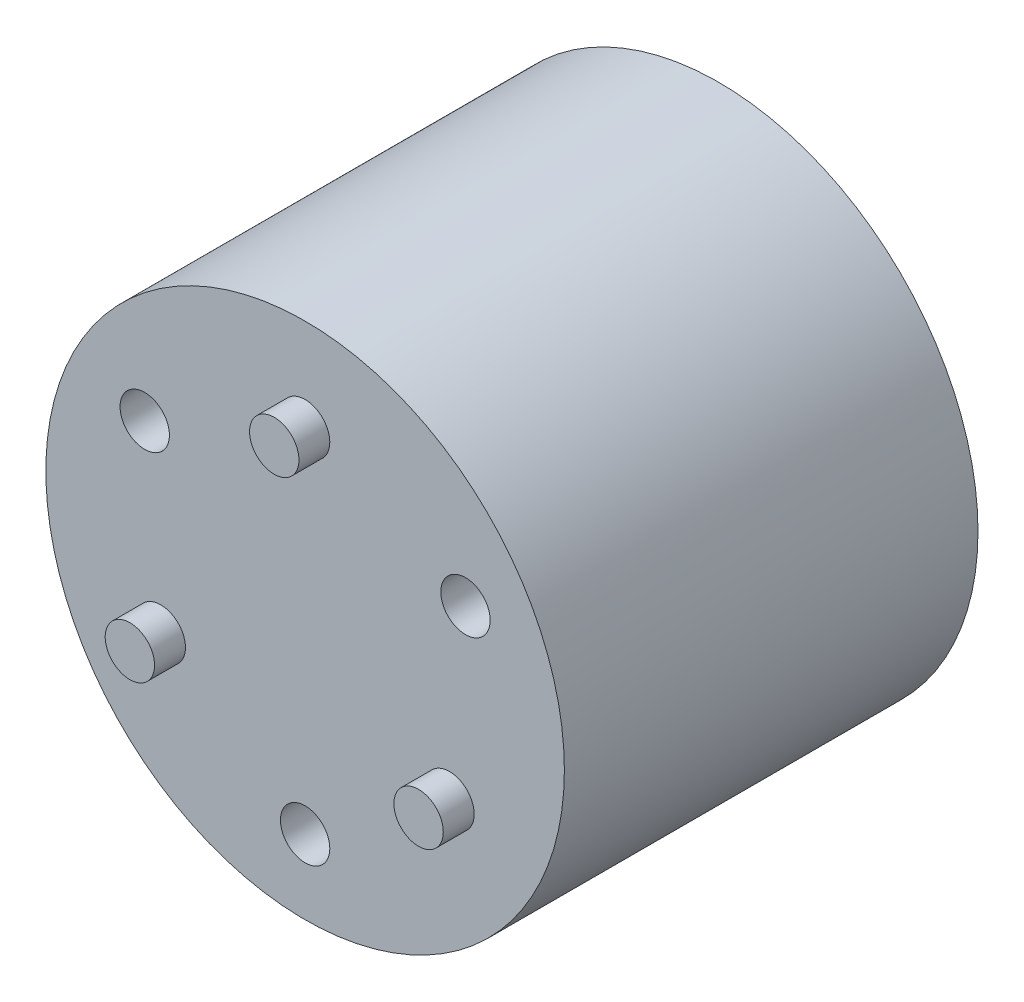
ISO-10303-21;
HEADER;
FILE_DESCRIPTION(('STEP AP214'),'2;1');
FILE_NAME('part.step','',(''),(''),'','','');
FILE_SCHEMA(('AUTOMOTIVE_DESIGN { 1 0 10303 214 1 1 1 1 }'));
ENDSEC;
DATA;
#1=APPLICATION_CONTEXT('core data for automotive mechanical design processes');
#2=APPLICATION_PROTOCOL_DEFINITION('international standard','automotive_design',2000,#1);
#3=PRODUCT_CONTEXT('',#1,'mechanical');
#4=PRODUCT('Part','Part','',(#3));
#5=PRODUCT_RELATED_PRODUCT_CATEGORY('part','',(#4));
#6=PRODUCT_DEFINITION_FORMATION('','',#4);
#7=PRODUCT_DEFINITION_CONTEXT('part definition',#1,'design');
#8=PRODUCT_DEFINITION('design','',#6,#7);
#9=PRODUCT_DEFINITION_SHAPE('','',#8);
#10=(LENGTH_UNIT() NAMED_UNIT(*) SI_UNIT(.MILLI.,.METRE.));
#11=(NAMED_UNIT(*) PLANE_ANGLE_UNIT() SI_UNIT($,.RADIAN.));
#12=(NAMED_UNIT(*) SI_UNIT($,.STERADIAN.) SOLID_ANGLE_UNIT());
#13=UNCERTAINTY_MEASURE_WITH_UNIT(LENGTH_MEASURE(1.E-05),#10,'distance_accuracy_value','');
#14=(GEOMETRIC_REPRESENTATION_CONTEXT(3) GLOBAL_UNCERTAINTY_ASSIGNED_CONTEXT((#13)) GLOBAL_UNIT_ASSIGNED_CONTEXT((#10,
#11,#12)) REPRESENTATION_CONTEXT('',''));
#15=CARTESIAN_POINT('',(0.,0.,0.));
#16=DIRECTION('',(0.,0.,1.));
#17=DIRECTION('',(1.,0.,0.));
#18=AXIS2_PLACEMENT_3D('',#15,#16,#17);
#19=CARTESIAN_POINT('',(0.,0.,-33.5));
#20=DIRECTION('',(0.,0.,1.));
#21=DIRECTION('',(1.,0.,0.));
#22=AXIS2_PLACEMENT_3D('',#19,#20,#21);
#23=CYLINDRICAL_SURFACE('',#22,21.);
#24=CARTESIAN_POINT('',(0.,0.,-33.5));
#25=DIRECTION('',(0.,0.,1.));
#26=DIRECTION('',(1.,0.,0.));
#27=AXIS2_PLACEMENT_3D('',#24,#25,#26);
#28=CIRCLE('',#27,21.);
#29=CARTESIAN_POINT('',(21.,0.,-33.5));
#30=VERTEX_POINT('',#29);
#31=EDGE_CURVE('E10',#30,#30,#28,.T.);
#32=ORIENTED_EDGE('',*,*,#31,.T.);
#33=EDGE_LOOP('',(#32));
#34=FACE_BOUND('',#33,.T.);
#35=CARTESIAN_POINT('',(0.,0.,0.));
#36=DIRECTION('',(0.,0.,1.));
#37=DIRECTION('',(1.,0.,0.));
#38=AXIS2_PLACEMENT_3D('',#35,#36,#37);
#39=CIRCLE('',#38,21.);
#40=CARTESIAN_POINT('',(21.,0.,0.));
#41=VERTEX_POINT('',#40);
#42=EDGE_CURVE('E44',#41,#41,#39,.T.);
#43=ORIENTED_EDGE('',*,*,#42,.F.);
#44=EDGE_LOOP('',(#43));
#45=FACE_BOUND('',#44,.T.);
#46=ADVANCED_FACE('F41',(#34,#45),#23,.T.);
#47=CARTESIAN_POINT('',(0.,0.,-33.5));
#48=DIRECTION('',(0.,0.,1.));
#49=DIRECTION('',(1.,0.,0.));
#50=AXIS2_PLACEMENT_3D('',#47,#48,#49);
#51=PLANE('',#50);
#52=ORIENTED_EDGE('',*,*,#31,.F.);
#53=EDGE_LOOP('',(#52));
#54=FACE_BOUND('',#53,.T.);
#55=ADVANCED_FACE('F109',(#54),#51,.F.);
#56=CARTESIAN_POINT('',(0.,0.,0.));
#57=DIRECTION('',(0.,0.,1.));
#58=DIRECTION('',(1.,0.,0.));
#59=AXIS2_PLACEMENT_3D('',#56,#57,#58);
#60=PLANE('',#59);
#61=CARTESIAN_POINT('',(-11.6913429510891,-6.7500000000005,0.));
#62=DIRECTION('',(0.,0.,1.));
#63=DIRECTION('',(1.,0.,0.));
#64=AXIS2_PLACEMENT_3D('',#61,#62,#63);
#65=CIRCLE('',#64,2.);
#66=CARTESIAN_POINT('',(-9.69134295108906,-6.7500000000005,0.));
#67=VERTEX_POINT('',#66);
#68=EDGE_CURVE('E91',#67,#67,#65,.T.);
#69=ORIENTED_EDGE('',*,*,#68,.F.);
#70=EDGE_LOOP('',(#69));
#71=FACE_BOUND('',#70,.T.);
#72=CARTESIAN_POINT('',(11.6913429510908,-6.74999999999949,0.));
#73=DIRECTION('',(0.,0.,1.));
#74=DIRECTION('',(1.,0.,0.));
#75=AXIS2_PLACEMENT_3D('',#72,#73,#74);
#76=CIRCLE('',#75,2.);
#77=CARTESIAN_POINT('',(13.6913429510908,-6.74999999999949,0.));
#78=VERTEX_POINT('',#77);
#79=EDGE_CURVE('E83',#78,#78,#76,.T.);
#80=ORIENTED_EDGE('',*,*,#79,.F.);
#81=EDGE_LOOP('',(#80));
#82=FACE_BOUND('',#81,.T.);
#83=CARTESIAN_POINT('',(0.,13.5,0.));
#84=DIRECTION('',(0.,0.,1.));
#85=DIRECTION('',(1.,0.,0.));
#86=AXIS2_PLACEMENT_3D('',#83,#84,#85);
#87=CIRCLE('',#86,2.);
#88=CARTESIAN_POINT('',(2.,13.5,0.));
#89=VERTEX_POINT('',#88);
#90=EDGE_CURVE('E79',#89,#89,#87,.T.);
#91=ORIENTED_EDGE('',*,*,#90,.F.);
#92=EDGE_LOOP('',(#91));
#93=FACE_BOUND('',#92,.T.);
#94=CARTESIAN_POINT('',(0.,-15.,0.));
#95=DIRECTION('',(0.,0.,1.));
#96=DIRECTION('',(1.,0.,0.));
#97=AXIS2_PLACEMENT_3D('',#94,#95,#96);
#98=CIRCLE('',#97,2.);
#99=CARTESIAN_POINT('',(2.,-15.,0.));
#100=VERTEX_POINT('',#99);
#101=EDGE_CURVE('E72',#100,#100,#98,.T.);
#102=ORIENTED_EDGE('',*,*,#101,.F.);
#103=EDGE_LOOP('',(#102));
#104=FACE_BOUND('',#103,.T.);
#105=CARTESIAN_POINT('',(-12.9903810567665,7.50000000000006,0.));
#106=DIRECTION('',(0.,0.,1.));
#107=DIRECTION('',(1.,0.,0.));
#108=AXIS2_PLACEMENT_3D('',#105,#106,#107);
#109=CIRCLE('',#108,2.);
#110=CARTESIAN_POINT('',(-10.9903810567665,7.50000000000006,0.));
#111=VERTEX_POINT('',#110);
#112=EDGE_CURVE('E68',#111,#111,#109,.T.);
#113=ORIENTED_EDGE('',*,*,#112,.F.);
#114=EDGE_LOOP('',(#113));
#115=FACE_BOUND('',#114,.T.);
#116=CARTESIAN_POINT('',(12.9903810567667,7.49999999999988,0.));
#117=DIRECTION('',(0.,0.,1.));
#118=DIRECTION('',(1.,0.,0.));
#119=AXIS2_PLACEMENT_3D('',#116,#117,#118);
#120=CIRCLE('',#119,2.);
#121=CARTESIAN_POINT('',(14.9903810567667,7.49999999999988,0.));
#122=VERTEX_POINT('',#121);
#123=EDGE_CURVE('E59',#122,#122,#120,.T.);
#124=ORIENTED_EDGE('',*,*,#123,.F.);
#125=EDGE_LOOP('',(#124));
#126=FACE_BOUND('',#125,.T.);
#127=ORIENTED_EDGE('',*,*,#42,.T.);
#128=EDGE_LOOP('',(#127));
#129=FACE_BOUND('',#128,.T.);
#130=ADVANCED_FACE('F105',(#71,#82,#93,#104,#115,#126,#129),#60,.T.);
#131=CARTESIAN_POINT('',(12.9903810567667,7.49999999999988,-4.));
#132=DIRECTION('',(0.,0.,1.));
#133=DIRECTION('',(1.,0.,0.));
#134=AXIS2_PLACEMENT_3D('',#131,#132,#133);
#135=CYLINDRICAL_SURFACE('',#134,2.);
#136=CARTESIAN_POINT('',(12.9903810567667,7.49999999999988,-4.));
#137=DIRECTION('',(0.,0.,1.));
#138=DIRECTION('',(1.,0.,0.));
#139=AXIS2_PLACEMENT_3D('',#136,#137,#138);
#140=CIRCLE('',#139,2.);
#141=CARTESIAN_POINT('',(14.9903810567667,7.49999999999988,-4.));
#142=VERTEX_POINT('',#141);
#143=EDGE_CURVE('E55',#142,#142,#140,.T.);
#144=ORIENTED_EDGE('',*,*,#143,.F.);
#145=EDGE_LOOP('',(#144));
#146=FACE_BOUND('',#145,.T.);
#147=ORIENTED_EDGE('',*,*,#123,.T.);
#148=EDGE_LOOP('',(#147));
#149=FACE_BOUND('',#148,.T.);
#150=ADVANCED_FACE('F108',(#146,#149),#135,.F.);
#151=CARTESIAN_POINT('',(12.9903810567667,7.49999999999988,-4.));
#152=DIRECTION('',(0.,0.,1.));
#153=DIRECTION('',(1.,0.,0.));
#154=AXIS2_PLACEMENT_3D('',#151,#152,#153);
#155=PLANE('',#154);
#156=ORIENTED_EDGE('',*,*,#143,.T.);
#157=EDGE_LOOP('',(#156));
#158=FACE_BOUND('',#157,.T.);
#159=ADVANCED_FACE('F131',(#158),#155,.T.);
#160=CARTESIAN_POINT('',(-12.9903810567665,7.50000000000006,-4.));
#161=DIRECTION('',(0.,0.,1.));
#162=DIRECTION('',(1.,0.,0.));
#163=AXIS2_PLACEMENT_3D('',#160,#161,#162);
#164=CYLINDRICAL_SURFACE('',#163,2.);
#165=CARTESIAN_POINT('',(-12.9903810567665,7.50000000000006,-4.));
#166=DIRECTION('',(0.,0.,1.));
#167=DIRECTION('',(1.,0.,0.));
#168=AXIS2_PLACEMENT_3D('',#165,#166,#167);
#169=CIRCLE('',#168,2.);
#170=CARTESIAN_POINT('',(-10.9903810567665,7.50000000000006,-4.));
#171=VERTEX_POINT('',#170);
#172=EDGE_CURVE('E64',#171,#171,#169,.T.);
#173=ORIENTED_EDGE('',*,*,#172,.F.);
#174=EDGE_LOOP('',(#173));
#175=FACE_BOUND('',#174,.T.);
#176=ORIENTED_EDGE('',*,*,#112,.T.);
#177=EDGE_LOOP('',(#176));
#178=FACE_BOUND('',#177,.T.);
#179=ADVANCED_FACE('F134',(#175,#178),#164,.F.);
#180=CARTESIAN_POINT('',(-12.9903810567665,7.50000000000006,-4.));
#181=DIRECTION('',(0.,0.,1.));
#182=DIRECTION('',(1.,0.,0.));
#183=AXIS2_PLACEMENT_3D('',#180,#181,#182);
#184=PLANE('',#183);
#185=ORIENTED_EDGE('',*,*,#172,.T.);
#186=EDGE_LOOP('',(#185));
#187=FACE_BOUND('',#186,.T.);
#188=ADVANCED_FACE('F139',(#187),#184,.T.);
#189=CARTESIAN_POINT('',(0.,-15.,-4.));
#190=DIRECTION('',(0.,0.,1.));
#191=DIRECTION('',(1.,0.,0.));
#192=AXIS2_PLACEMENT_3D('',#189,#190,#191);
#193=CYLINDRICAL_SURFACE('',#192,2.);
#194=CARTESIAN_POINT('',(0.,-15.,-4.));
#195=DIRECTION('',(0.,0.,1.));
#196=DIRECTION('',(1.,0.,0.));
#197=AXIS2_PLACEMENT_3D('',#194,#195,#196);
#198=CIRCLE('',#197,2.);
#199=CARTESIAN_POINT('',(2.,-15.,-4.));
#200=VERTEX_POINT('',#199);
#201=EDGE_CURVE('E53',#200,#200,#198,.T.);
#202=ORIENTED_EDGE('',*,*,#201,.F.);
#203=EDGE_LOOP('',(#202));
#204=FACE_BOUND('',#203,.T.);
#205=ORIENTED_EDGE('',*,*,#101,.T.);
#206=EDGE_LOOP('',(#205));
#207=FACE_BOUND('',#206,.T.);
#208=ADVANCED_FACE('F142',(#204,#207),#193,.F.);
#209=CARTESIAN_POINT('',(0.,-15.,-4.));
#210=DIRECTION('',(0.,0.,1.));
#211=DIRECTION('',(1.,0.,0.));
#212=AXIS2_PLACEMENT_3D('',#209,#210,#211);
#213=PLANE('',#212);
#214=ORIENTED_EDGE('',*,*,#201,.T.);
#215=EDGE_LOOP('',(#214));
#216=FACE_BOUND('',#215,.T.);
#217=ADVANCED_FACE('F149',(#216),#213,.T.);
#218=CARTESIAN_POINT('',(0.,13.5,2.5));
#219=DIRECTION('',(0.,0.,-1.));
#220=DIRECTION('',(-1.,0.,0.));
#221=AXIS2_PLACEMENT_3D('',#218,#219,#220);
#222=CYLINDRICAL_SURFACE('',#221,2.);
#223=CARTESIAN_POINT('',(0.,13.5,2.5));
#224=DIRECTION('',(0.,0.,1.));
#225=DIRECTION('',(1.,0.,0.));
#226=AXIS2_PLACEMENT_3D('',#223,#224,#225);
#227=CIRCLE('',#226,2.);
#228=CARTESIAN_POINT('',(2.,13.5,2.5));
#229=VERTEX_POINT('',#228);
#230=EDGE_CURVE('E60',#229,#229,#227,.T.);
#231=ORIENTED_EDGE('',*,*,#230,.F.);
#232=EDGE_LOOP('',(#231));
#233=FACE_BOUND('',#232,.T.);
#234=ORIENTED_EDGE('',*,*,#90,.T.);
#235=EDGE_LOOP('',(#234));
#236=FACE_BOUND('',#235,.T.);
#237=ADVANCED_FACE('F153',(#233,#236),#222,.T.);
#238=CARTESIAN_POINT('',(0.,13.5,2.5));
#239=DIRECTION('',(0.,0.,1.));
#240=DIRECTION('',(1.,0.,0.));
#241=AXIS2_PLACEMENT_3D('',#238,#239,#240);
#242=PLANE('',#241);
#243=ORIENTED_EDGE('',*,*,#230,.T.);
#244=EDGE_LOOP('',(#243));
#245=FACE_BOUND('',#244,.T.);
#246=ADVANCED_FACE('F157',(#245),#242,.T.);
#247=CARTESIAN_POINT('',(11.6913429510908,-6.74999999999949,2.5));
#248=DIRECTION('',(0.,0.,-1.));
#249=DIRECTION('',(-1.,0.,0.));
#250=AXIS2_PLACEMENT_3D('',#247,#248,#249);
#251=CYLINDRICAL_SURFACE('',#250,2.);
#252=CARTESIAN_POINT('',(11.6913429510908,-6.74999999999949,2.5));
#253=DIRECTION('',(0.,0.,1.));
#254=DIRECTION('',(1.,0.,0.));
#255=AXIS2_PLACEMENT_3D('',#252,#253,#254);
#256=CIRCLE('',#255,2.);
#257=CARTESIAN_POINT('',(13.6913429510908,-6.74999999999949,2.5));
#258=VERTEX_POINT('',#257);
#259=EDGE_CURVE('E87',#258,#258,#256,.T.);
#260=ORIENTED_EDGE('',*,*,#259,.F.);
#261=EDGE_LOOP('',(#260));
#262=FACE_BOUND('',#261,.T.);
#263=ORIENTED_EDGE('',*,*,#79,.T.);
#264=EDGE_LOOP('',(#263));
#265=FACE_BOUND('',#264,.T.);
#266=ADVANCED_FACE('F161',(#262,#265),#251,.T.);
#267=CARTESIAN_POINT('',(11.6913429510908,-6.74999999999949,2.5));
#268=DIRECTION('',(0.,0.,1.));
#269=DIRECTION('',(1.,0.,0.));
#270=AXIS2_PLACEMENT_3D('',#267,#268,#269);
#271=PLANE('',#270);
#272=ORIENTED_EDGE('',*,*,#259,.T.);
#273=EDGE_LOOP('',(#272));
#274=FACE_BOUND('',#273,.T.);
#275=ADVANCED_FACE('F163',(#274),#271,.T.);
#276=CARTESIAN_POINT('',(-11.6913429510891,-6.7500000000005,2.5));
#277=DIRECTION('',(0.,0.,-1.));
#278=DIRECTION('',(-1.,0.,0.));
#279=AXIS2_PLACEMENT_3D('',#276,#277,#278);
#280=CYLINDRICAL_SURFACE('',#279,2.);
#281=CARTESIAN_POINT('',(-11.6913429510891,-6.7500000000005,2.5));
#282=DIRECTION('',(0.,0.,1.));
#283=DIRECTION('',(1.,0.,0.));
#284=AXIS2_PLACEMENT_3D('',#281,#282,#283);
#285=CIRCLE('',#284,2.);
#286=CARTESIAN_POINT('',(-9.69134295108906,-6.7500000000005,2.5));
#287=VERTEX_POINT('',#286);
#288=EDGE_CURVE('E95',#287,#287,#285,.T.);
#289=ORIENTED_EDGE('',*,*,#288,.F.);
#290=EDGE_LOOP('',(#289));
#291=FACE_BOUND('',#290,.T.);
#292=ORIENTED_EDGE('',*,*,#68,.T.);
#293=EDGE_LOOP('',(#292));
#294=FACE_BOUND('',#293,.T.);
#295=ADVANCED_FACE('F103',(#291,#294),#280,.T.);
#296=CARTESIAN_POINT('',(-11.6913429510891,-6.7500000000005,2.5));
#297=DIRECTION('',(0.,0.,1.));
#298=DIRECTION('',(1.,0.,0.));
#299=AXIS2_PLACEMENT_3D('',#296,#297,#298);
#300=PLANE('',#299);
#301=ORIENTED_EDGE('',*,*,#288,.T.);
#302=EDGE_LOOP('',(#301));
#303=FACE_BOUND('',#302,.T.);
#304=ADVANCED_FACE('F170',(#303),#300,.T.);
#305=CLOSED_SHELL('',(#46,#55,#130,#150,#159,#179,#188,#208,#217,#237,#246,#266,#275,#295,#304));
#306=MANIFOLD_SOLID_BREP('B2',#305);
#307=ADVANCED_BREP_SHAPE_REPRESENTATION('',(#18,#306),#14);
#308=SHAPE_DEFINITION_REPRESENTATION(#9,#307);
ENDSEC;
END-ISO-10303-21;
